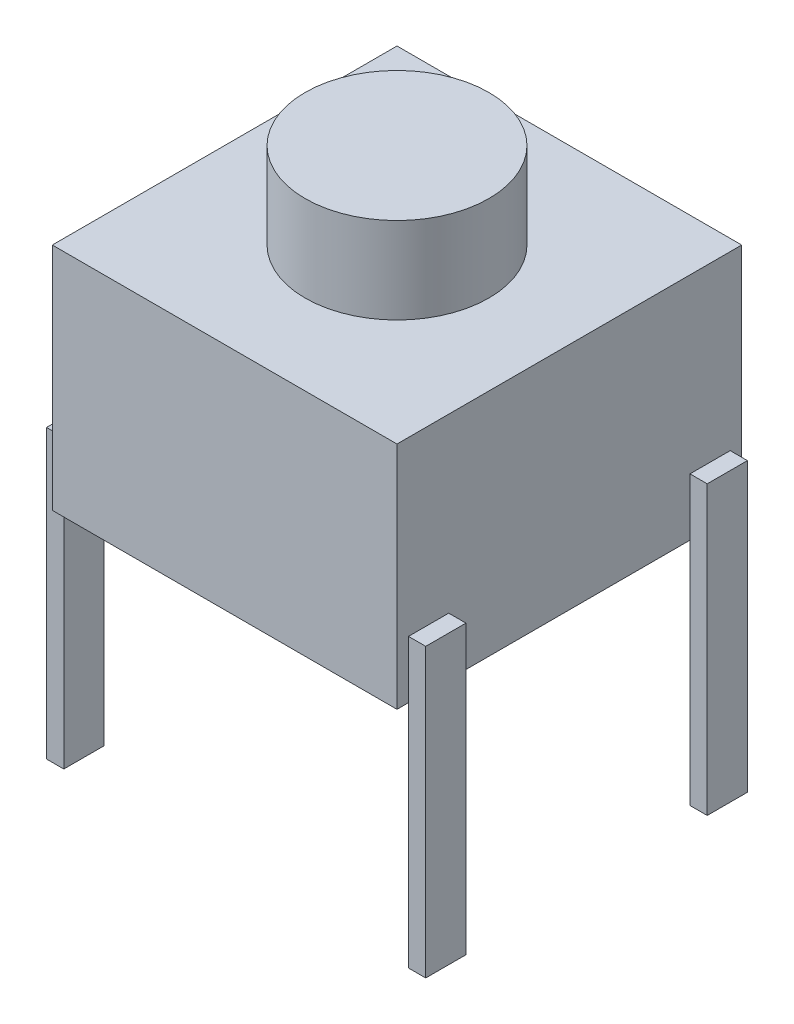
ISO-10303-21;
HEADER;
FILE_DESCRIPTION(('STEP AP214'),'2;1');
FILE_NAME('part.step','',(''),(''),'','','');
FILE_SCHEMA(('AUTOMOTIVE_DESIGN { 1 0 10303 214 1 1 1 1 }'));
ENDSEC;
DATA;
#1=APPLICATION_CONTEXT('core data for automotive mechanical design processes');
#2=APPLICATION_PROTOCOL_DEFINITION('international standard','automotive_design',2000,#1);
#3=PRODUCT_CONTEXT('',#1,'mechanical');
#4=PRODUCT('Part','Part','',(#3));
#5=PRODUCT_RELATED_PRODUCT_CATEGORY('part','',(#4));
#6=PRODUCT_DEFINITION_FORMATION('','',#4);
#7=PRODUCT_DEFINITION_CONTEXT('part definition',#1,'design');
#8=PRODUCT_DEFINITION('design','',#6,#7);
#9=PRODUCT_DEFINITION_SHAPE('','',#8);
#10=(LENGTH_UNIT() NAMED_UNIT(*) SI_UNIT(.MILLI.,.METRE.));
#11=(NAMED_UNIT(*) PLANE_ANGLE_UNIT() SI_UNIT($,.RADIAN.));
#12=(NAMED_UNIT(*) SI_UNIT($,.STERADIAN.) SOLID_ANGLE_UNIT());
#13=UNCERTAINTY_MEASURE_WITH_UNIT(LENGTH_MEASURE(1.E-05),#10,'distance_accuracy_value','');
#14=(GEOMETRIC_REPRESENTATION_CONTEXT(3) GLOBAL_UNCERTAINTY_ASSIGNED_CONTEXT((#13)) GLOBAL_UNIT_ASSIGNED_CONTEXT((#10,
#11,#12)) REPRESENTATION_CONTEXT('',''));
#15=CARTESIAN_POINT('',(0.,0.,0.));
#16=DIRECTION('',(0.,0.,1.));
#17=DIRECTION('',(1.,0.,0.));
#18=AXIS2_PLACEMENT_3D('',#15,#16,#17);
#19=CARTESIAN_POINT('',(6.,4.,0.));
#20=DIRECTION('',(-1.,0.,0.));
#21=DIRECTION('',(0.,0.,1.));
#22=AXIS2_PLACEMENT_3D('',#19,#20,#21);
#23=PLANE('',#22);
#24=DIRECTION('',(0.,1.,0.));
#25=VECTOR('',#24,1.);
#26=CARTESIAN_POINT('',(6.,1.,-5.1));
#27=LINE('',#26,#25);
#28=CARTESIAN_POINT('',(6.,0.,-5.1));
#29=VERTEX_POINT('',#28);
#30=CARTESIAN_POINT('',(6.,1.,-5.1));
#31=VERTEX_POINT('',#30);
#32=EDGE_CURVE('E54',#29,#31,#27,.T.);
#33=ORIENTED_EDGE('',*,*,#32,.T.);
#34=DIRECTION('',(0.,0.,-1.));
#35=VECTOR('',#34,1.);
#36=CARTESIAN_POINT('',(6.,1.,-5.1));
#37=LINE('',#36,#35);
#38=CARTESIAN_POINT('',(6.,1.,-5.8));
#39=VERTEX_POINT('',#38);
#40=EDGE_CURVE('E58',#31,#39,#37,.T.);
#41=ORIENTED_EDGE('',*,*,#40,.T.);
#42=DIRECTION('',(0.,-1.,0.));
#43=VECTOR('',#42,1.);
#44=CARTESIAN_POINT('',(6.,1.,-5.8));
#45=LINE('',#44,#43);
#46=CARTESIAN_POINT('',(6.,0.,-5.8));
#47=VERTEX_POINT('',#46);
#48=EDGE_CURVE('E210',#39,#47,#45,.T.);
#49=ORIENTED_EDGE('',*,*,#48,.T.);
#50=DIRECTION('',(0.,0.,-1.));
#51=VECTOR('',#50,1.);
#52=CARTESIAN_POINT('',(6.,0.,0.));
#53=LINE('',#52,#51);
#54=CARTESIAN_POINT('',(6.,0.,-6.));
#55=VERTEX_POINT('',#54);
#56=EDGE_CURVE('E366',#47,#55,#53,.T.);
#57=ORIENTED_EDGE('',*,*,#56,.T.);
#58=DIRECTION('',(0.,-1.,0.));
#59=VECTOR('',#58,1.);
#60=CARTESIAN_POINT('',(6.,4.,-6.));
#61=LINE('',#60,#59);
#62=CARTESIAN_POINT('',(6.,4.,-6.));
#63=VERTEX_POINT('',#62);
#64=EDGE_CURVE('E374',#63,#55,#61,.T.);
#65=ORIENTED_EDGE('',*,*,#64,.F.);
#66=DIRECTION('',(0.,0.,-1.));
#67=VECTOR('',#66,1.);
#68=CARTESIAN_POINT('',(6.,4.,0.));
#69=LINE('',#68,#67);
#70=CARTESIAN_POINT('',(6.,4.,0.));
#71=VERTEX_POINT('',#70);
#72=EDGE_CURVE('E353',#71,#63,#69,.T.);
#73=ORIENTED_EDGE('',*,*,#72,.F.);
#74=DIRECTION('',(0.,-1.,0.));
#75=VECTOR('',#74,1.);
#76=CARTESIAN_POINT('',(6.,4.,0.));
#77=LINE('',#76,#75);
#78=CARTESIAN_POINT('',(6.,0.,0.));
#79=VERTEX_POINT('',#78);
#80=EDGE_CURVE('E376',#71,#79,#77,.T.);
#81=ORIENTED_EDGE('',*,*,#80,.T.);
#82=CARTESIAN_POINT('',(6.,0.,-0.2));
#83=VERTEX_POINT('',#82);
#84=EDGE_CURVE('E367',#79,#83,#53,.T.);
#85=ORIENTED_EDGE('',*,*,#84,.T.);
#86=DIRECTION('',(0.,1.,0.));
#87=VECTOR('',#86,1.);
#88=CARTESIAN_POINT('',(6.,1.,-0.2));
#89=LINE('',#88,#87);
#90=CARTESIAN_POINT('',(6.,1.,-0.2));
#91=VERTEX_POINT('',#90);
#92=EDGE_CURVE('E11',#83,#91,#89,.T.);
#93=ORIENTED_EDGE('',*,*,#92,.T.);
#94=DIRECTION('',(0.,0.,-1.));
#95=VECTOR('',#94,1.);
#96=CARTESIAN_POINT('',(6.,1.,-0.2));
#97=LINE('',#96,#95);
#98=CARTESIAN_POINT('',(6.,1.,-0.9));
#99=VERTEX_POINT('',#98);
#100=EDGE_CURVE('E278',#91,#99,#97,.T.);
#101=ORIENTED_EDGE('',*,*,#100,.T.);
#102=DIRECTION('',(0.,-1.,0.));
#103=VECTOR('',#102,1.);
#104=CARTESIAN_POINT('',(6.,1.,-0.9));
#105=LINE('',#104,#103);
#106=CARTESIAN_POINT('',(6.,0.,-0.9));
#107=VERTEX_POINT('',#106);
#108=EDGE_CURVE('E283',#99,#107,#105,.T.);
#109=ORIENTED_EDGE('',*,*,#108,.T.);
#110=EDGE_CURVE('E420',#107,#29,#53,.T.);
#111=ORIENTED_EDGE('',*,*,#110,.T.);
#112=EDGE_LOOP('',(#33,#41,#49,#57,#65,#73,#81,#85,#93,#101,#109,#111));
#113=FACE_BOUND('',#112,.T.);
#114=ADVANCED_FACE('F36',(#113),#23,.F.);
#115=CARTESIAN_POINT('',(0.,4.,0.));
#116=DIRECTION('',(1.,0.,0.));
#117=DIRECTION('',(0.,0.,-1.));
#118=AXIS2_PLACEMENT_3D('',#115,#116,#117);
#119=PLANE('',#118);
#120=DIRECTION('',(0.,1.,0.));
#121=VECTOR('',#120,1.);
#122=CARTESIAN_POINT('',(0.,1.,-5.1));
#123=LINE('',#122,#121);
#124=CARTESIAN_POINT('',(0.,0.,-5.1));
#125=VERTEX_POINT('',#124);
#126=CARTESIAN_POINT('',(0.,1.,-5.1));
#127=VERTEX_POINT('',#126);
#128=EDGE_CURVE('E242',#125,#127,#123,.T.);
#129=ORIENTED_EDGE('',*,*,#128,.F.);
#130=DIRECTION('',(0.,0.,1.));
#131=VECTOR('',#130,1.);
#132=CARTESIAN_POINT('',(0.,0.,0.));
#133=LINE('',#132,#131);
#134=CARTESIAN_POINT('',(0.,0.,-0.9));
#135=VERTEX_POINT('',#134);
#136=EDGE_CURVE('E363',#125,#135,#133,.T.);
#137=ORIENTED_EDGE('',*,*,#136,.T.);
#138=DIRECTION('',(0.,-1.,0.));
#139=VECTOR('',#138,1.);
#140=CARTESIAN_POINT('',(0.,1.,-0.9));
#141=LINE('',#140,#139);
#142=CARTESIAN_POINT('',(0.,1.,-0.9));
#143=VERTEX_POINT('',#142);
#144=EDGE_CURVE('E325',#143,#135,#141,.T.);
#145=ORIENTED_EDGE('',*,*,#144,.F.);
#146=DIRECTION('',(0.,0.,-1.));
#147=VECTOR('',#146,1.);
#148=CARTESIAN_POINT('',(0.,1.,-0.2));
#149=LINE('',#148,#147);
#150=CARTESIAN_POINT('',(0.,1.,-0.2));
#151=VERTEX_POINT('',#150);
#152=EDGE_CURVE('E321',#151,#143,#149,.T.);
#153=ORIENTED_EDGE('',*,*,#152,.F.);
#154=DIRECTION('',(0.,1.,0.));
#155=VECTOR('',#154,1.);
#156=CARTESIAN_POINT('',(0.,1.,-0.2));
#157=LINE('',#156,#155);
#158=CARTESIAN_POINT('',(0.,0.,-0.2));
#159=VERTEX_POINT('',#158);
#160=EDGE_CURVE('E45',#159,#151,#157,.T.);
#161=ORIENTED_EDGE('',*,*,#160,.F.);
#162=CARTESIAN_POINT('',(0.,0.,0.));
#163=VERTEX_POINT('',#162);
#164=EDGE_CURVE('E343',#159,#163,#133,.T.);
#165=ORIENTED_EDGE('',*,*,#164,.T.);
#166=DIRECTION('',(0.,-1.,0.));
#167=VECTOR('',#166,1.);
#168=CARTESIAN_POINT('',(0.,4.,0.));
#169=LINE('',#168,#167);
#170=CARTESIAN_POINT('',(0.,4.,0.));
#171=VERTEX_POINT('',#170);
#172=EDGE_CURVE('E40',#171,#163,#169,.T.);
#173=ORIENTED_EDGE('',*,*,#172,.F.);
#174=DIRECTION('',(0.,0.,1.));
#175=VECTOR('',#174,1.);
#176=CARTESIAN_POINT('',(0.,4.,0.));
#177=LINE('',#176,#175);
#178=CARTESIAN_POINT('',(0.,4.,-6.));
#179=VERTEX_POINT('',#178);
#180=EDGE_CURVE('E347',#179,#171,#177,.T.);
#181=ORIENTED_EDGE('',*,*,#180,.F.);
#182=DIRECTION('',(0.,-1.,0.));
#183=VECTOR('',#182,1.);
#184=CARTESIAN_POINT('',(0.,4.,-6.));
#185=LINE('',#184,#183);
#186=CARTESIAN_POINT('',(0.,0.,-6.));
#187=VERTEX_POINT('',#186);
#188=EDGE_CURVE('E357',#179,#187,#185,.T.);
#189=ORIENTED_EDGE('',*,*,#188,.T.);
#190=CARTESIAN_POINT('',(0.,0.,-5.8));
#191=VERTEX_POINT('',#190);
#192=EDGE_CURVE('E358',#187,#191,#133,.T.);
#193=ORIENTED_EDGE('',*,*,#192,.T.);
#194=DIRECTION('',(0.,-1.,0.));
#195=VECTOR('',#194,1.);
#196=CARTESIAN_POINT('',(0.,1.,-5.8));
#197=LINE('',#196,#195);
#198=CARTESIAN_POINT('',(0.,1.,-5.8));
#199=VERTEX_POINT('',#198);
#200=EDGE_CURVE('E261',#199,#191,#197,.T.);
#201=ORIENTED_EDGE('',*,*,#200,.F.);
#202=DIRECTION('',(0.,0.,-1.));
#203=VECTOR('',#202,1.);
#204=CARTESIAN_POINT('',(0.,1.,-5.1));
#205=LINE('',#204,#203);
#206=EDGE_CURVE('E257',#127,#199,#205,.T.);
#207=ORIENTED_EDGE('',*,*,#206,.F.);
#208=EDGE_LOOP('',(#129,#137,#145,#153,#161,#165,#173,#181,#189,#193,#201,#207));
#209=FACE_BOUND('',#208,.T.);
#210=ADVANCED_FACE('F38',(#209),#119,.F.);
#211=CARTESIAN_POINT('',(0.,4.,0.));
#212=DIRECTION('',(0.,0.,-1.));
#213=DIRECTION('',(-1.,0.,0.));
#214=AXIS2_PLACEMENT_3D('',#211,#212,#213);
#215=PLANE('',#214);
#216=DIRECTION('',(1.,0.,0.));
#217=VECTOR('',#216,1.);
#218=CARTESIAN_POINT('',(0.,0.,0.));
#219=LINE('',#218,#217);
#220=EDGE_CURVE('E361',#163,#79,#219,.T.);
#221=ORIENTED_EDGE('',*,*,#220,.T.);
#222=ORIENTED_EDGE('',*,*,#80,.F.);
#223=DIRECTION('',(1.,0.,0.));
#224=VECTOR('',#223,1.);
#225=CARTESIAN_POINT('',(0.,4.,0.));
#226=LINE('',#225,#224);
#227=EDGE_CURVE('E350',#171,#71,#226,.T.);
#228=ORIENTED_EDGE('',*,*,#227,.F.);
#229=ORIENTED_EDGE('',*,*,#172,.T.);
#230=EDGE_LOOP('',(#221,#222,#228,#229));
#231=FACE_BOUND('',#230,.T.);
#232=ADVANCED_FACE('F384',(#231),#215,.F.);
#233=CARTESIAN_POINT('',(0.,4.,-6.));
#234=DIRECTION('',(0.,0.,1.));
#235=DIRECTION('',(1.,0.,0.));
#236=AXIS2_PLACEMENT_3D('',#233,#234,#235);
#237=PLANE('',#236);
#238=DIRECTION('',(-1.,0.,0.));
#239=VECTOR('',#238,1.);
#240=CARTESIAN_POINT('',(0.,0.,-6.));
#241=LINE('',#240,#239);
#242=EDGE_CURVE('E351',#55,#187,#241,.T.);
#243=ORIENTED_EDGE('',*,*,#242,.T.);
#244=ORIENTED_EDGE('',*,*,#188,.F.);
#245=DIRECTION('',(-1.,0.,0.));
#246=VECTOR('',#245,1.);
#247=CARTESIAN_POINT('',(0.,4.,-6.));
#248=LINE('',#247,#246);
#249=EDGE_CURVE('E355',#63,#179,#248,.T.);
#250=ORIENTED_EDGE('',*,*,#249,.F.);
#251=ORIENTED_EDGE('',*,*,#64,.T.);
#252=EDGE_LOOP('',(#243,#244,#250,#251));
#253=FACE_BOUND('',#252,.T.);
#254=ADVANCED_FACE('F425',(#253),#237,.F.);
#255=CARTESIAN_POINT('',(0.,4.,0.));
#256=DIRECTION('',(0.,-1.,0.));
#257=DIRECTION('',(0.,0.,-1.));
#258=AXIS2_PLACEMENT_3D('',#255,#256,#257);
#259=PLANE('',#258);
#260=CARTESIAN_POINT('',(3.,4.,-3.));
#261=DIRECTION('',(0.,1.,0.));
#262=DIRECTION('',(0.,0.,1.));
#263=AXIS2_PLACEMENT_3D('',#260,#261,#262);
#264=CIRCLE('',#263,1.6);
#265=CARTESIAN_POINT('',(3.,4.,-1.4));
#266=VERTEX_POINT('',#265);
#267=EDGE_CURVE('E344',#266,#266,#264,.T.);
#268=ORIENTED_EDGE('',*,*,#267,.F.);
#269=EDGE_LOOP('',(#268));
#270=FACE_BOUND('',#269,.T.);
#271=ORIENTED_EDGE('',*,*,#180,.T.);
#272=ORIENTED_EDGE('',*,*,#227,.T.);
#273=ORIENTED_EDGE('',*,*,#72,.T.);
#274=ORIENTED_EDGE('',*,*,#249,.T.);
#275=EDGE_LOOP('',(#271,#272,#273,#274));
#276=FACE_BOUND('',#275,.T.);
#277=ADVANCED_FACE('F472',(#270,#276),#259,.F.);
#278=CARTESIAN_POINT('',(0.,0.,0.));
#279=DIRECTION('',(0.,-1.,0.));
#280=DIRECTION('',(0.,0.,-1.));
#281=AXIS2_PLACEMENT_3D('',#278,#279,#280);
#282=PLANE('',#281);
#283=ORIENTED_EDGE('',*,*,#192,.F.);
#284=ORIENTED_EDGE('',*,*,#242,.F.);
#285=ORIENTED_EDGE('',*,*,#56,.F.);
#286=EDGE_CURVE('E207',#29,#47,#53,.T.);
#287=ORIENTED_EDGE('',*,*,#286,.F.);
#288=ORIENTED_EDGE('',*,*,#110,.F.);
#289=EDGE_CURVE('E370',#83,#107,#53,.T.);
#290=ORIENTED_EDGE('',*,*,#289,.F.);
#291=ORIENTED_EDGE('',*,*,#84,.F.);
#292=ORIENTED_EDGE('',*,*,#220,.F.);
#293=ORIENTED_EDGE('',*,*,#164,.F.);
#294=EDGE_CURVE('E364',#135,#159,#133,.T.);
#295=ORIENTED_EDGE('',*,*,#294,.F.);
#296=ORIENTED_EDGE('',*,*,#136,.F.);
#297=EDGE_CURVE('E362',#191,#125,#133,.T.);
#298=ORIENTED_EDGE('',*,*,#297,.F.);
#299=EDGE_LOOP('',(#283,#284,#285,#287,#288,#290,#291,#292,#293,#295,#296,#298));
#300=FACE_BOUND('',#299,.T.);
#301=ADVANCED_FACE('F395',(#300),#282,.T.);
#302=CARTESIAN_POINT('',(3.,5.5,-3.));
#303=DIRECTION('',(0.,-1.,0.));
#304=DIRECTION('',(0.,0.,-1.));
#305=AXIS2_PLACEMENT_3D('',#302,#303,#304);
#306=CYLINDRICAL_SURFACE('',#305,1.6);
#307=CARTESIAN_POINT('',(3.,5.5,-3.));
#308=DIRECTION('',(0.,1.,0.));
#309=DIRECTION('',(0.,0.,1.));
#310=AXIS2_PLACEMENT_3D('',#307,#308,#309);
#311=CIRCLE('',#310,1.6);
#312=CARTESIAN_POINT('',(3.,5.5,-1.4));
#313=VERTEX_POINT('',#312);
#314=EDGE_CURVE('E340',#313,#313,#311,.T.);
#315=ORIENTED_EDGE('',*,*,#314,.F.);
#316=EDGE_LOOP('',(#315));
#317=FACE_BOUND('',#316,.T.);
#318=ORIENTED_EDGE('',*,*,#267,.T.);
#319=EDGE_LOOP('',(#318));
#320=FACE_BOUND('',#319,.T.);
#321=ADVANCED_FACE('F481',(#317,#320),#306,.T.);
#322=CARTESIAN_POINT('',(3.,5.5,-3.));
#323=DIRECTION('',(0.,1.,0.));
#324=DIRECTION('',(0.,0.,1.));
#325=AXIS2_PLACEMENT_3D('',#322,#323,#324);
#326=PLANE('',#325);
#327=ORIENTED_EDGE('',*,*,#314,.T.);
#328=EDGE_LOOP('',(#327));
#329=FACE_BOUND('',#328,.T.);
#330=ADVANCED_FACE('F487',(#329),#326,.T.);
#331=CARTESIAN_POINT('',(-0.3,1.,-0.2));
#332=DIRECTION('',(0.,0.,-1.));
#333=DIRECTION('',(0.,1.,0.));
#334=AXIS2_PLACEMENT_3D('',#331,#332,#333);
#335=PLANE('',#334);
#336=CARTESIAN_POINT('',(0.,-4.,-0.199999999999999));
#337=VERTEX_POINT('',#336);
#338=EDGE_CURVE('E307',#337,#159,#157,.T.);
#339=ORIENTED_EDGE('',*,*,#338,.T.);
#340=ORIENTED_EDGE('',*,*,#160,.T.);
#341=DIRECTION('',(1.,0.,0.));
#342=VECTOR('',#341,1.);
#343=CARTESIAN_POINT('',(-0.3,1.,-0.2));
#344=LINE('',#343,#342);
#345=CARTESIAN_POINT('',(-0.3,1.,-0.2));
#346=VERTEX_POINT('',#345);
#347=EDGE_CURVE('E337',#346,#151,#344,.T.);
#348=ORIENTED_EDGE('',*,*,#347,.F.);
#349=DIRECTION('',(0.,1.,0.));
#350=VECTOR('',#349,1.);
#351=CARTESIAN_POINT('',(-0.3,1.,-0.2));
#352=LINE('',#351,#350);
#353=CARTESIAN_POINT('',(-0.3,-4.,-0.199999999999999));
#354=VERTEX_POINT('',#353);
#355=EDGE_CURVE('E308',#354,#346,#352,.T.);
#356=ORIENTED_EDGE('',*,*,#355,.F.);
#357=DIRECTION('',(1.,0.,0.));
#358=VECTOR('',#357,1.);
#359=CARTESIAN_POINT('',(-0.3,-4.,-0.199999999999999));
#360=LINE('',#359,#358);
#361=EDGE_CURVE('E318',#354,#337,#360,.T.);
#362=ORIENTED_EDGE('',*,*,#361,.T.);
#363=EDGE_LOOP('',(#339,#340,#348,#356,#362));
#364=FACE_BOUND('',#363,.T.);
#365=ADVANCED_FACE('F491',(#364),#335,.F.);
#366=CARTESIAN_POINT('',(-0.3,1.,-0.2));
#367=DIRECTION('',(0.,-1.,0.));
#368=DIRECTION('',(0.,0.,-1.));
#369=AXIS2_PLACEMENT_3D('',#366,#367,#368);
#370=PLANE('',#369);
#371=ORIENTED_EDGE('',*,*,#152,.T.);
#372=DIRECTION('',(1.,0.,0.));
#373=VECTOR('',#372,1.);
#374=CARTESIAN_POINT('',(-0.3,1.,-0.9));
#375=LINE('',#374,#373);
#376=CARTESIAN_POINT('',(-0.3,1.,-0.9));
#377=VERTEX_POINT('',#376);
#378=EDGE_CURVE('E334',#377,#143,#375,.T.);
#379=ORIENTED_EDGE('',*,*,#378,.F.);
#380=DIRECTION('',(0.,0.,-1.));
#381=VECTOR('',#380,1.);
#382=CARTESIAN_POINT('',(-0.3,1.,-0.2));
#383=LINE('',#382,#381);
#384=EDGE_CURVE('E311',#346,#377,#383,.T.);
#385=ORIENTED_EDGE('',*,*,#384,.F.);
#386=ORIENTED_EDGE('',*,*,#347,.T.);
#387=EDGE_LOOP('',(#371,#379,#385,#386));
#388=FACE_BOUND('',#387,.T.);
#389=ADVANCED_FACE('F495',(#388),#370,.F.);
#390=CARTESIAN_POINT('',(-0.3,1.,-0.9));
#391=DIRECTION('',(0.,0.,1.));
#392=DIRECTION('',(0.,-1.,0.));
#393=AXIS2_PLACEMENT_3D('',#390,#391,#392);
#394=PLANE('',#393);
#395=ORIENTED_EDGE('',*,*,#144,.T.);
#396=CARTESIAN_POINT('',(0.,-4.,-0.899999999999999));
#397=VERTEX_POINT('',#396);
#398=EDGE_CURVE('E324',#135,#397,#141,.T.);
#399=ORIENTED_EDGE('',*,*,#398,.T.);
#400=DIRECTION('',(1.,0.,0.));
#401=VECTOR('',#400,1.);
#402=CARTESIAN_POINT('',(-0.3,-4.,-0.899999999999999));
#403=LINE('',#402,#401);
#404=CARTESIAN_POINT('',(-0.3,-4.,-0.899999999999999));
#405=VERTEX_POINT('',#404);
#406=EDGE_CURVE('E331',#405,#397,#403,.T.);
#407=ORIENTED_EDGE('',*,*,#406,.F.);
#408=DIRECTION('',(0.,-1.,0.));
#409=VECTOR('',#408,1.);
#410=CARTESIAN_POINT('',(-0.3,1.,-0.9));
#411=LINE('',#410,#409);
#412=EDGE_CURVE('E314',#377,#405,#411,.T.);
#413=ORIENTED_EDGE('',*,*,#412,.F.);
#414=ORIENTED_EDGE('',*,*,#378,.T.);
#415=EDGE_LOOP('',(#395,#399,#407,#413,#414));
#416=FACE_BOUND('',#415,.T.);
#417=ADVANCED_FACE('F499',(#416),#394,.F.);
#418=CARTESIAN_POINT('',(-0.3,-4.,-0.199999999999999));
#419=DIRECTION('',(0.,1.,0.));
#420=DIRECTION('',(0.,0.,1.));
#421=AXIS2_PLACEMENT_3D('',#418,#419,#420);
#422=PLANE('',#421);
#423=DIRECTION('',(0.,0.,1.));
#424=VECTOR('',#423,1.);
#425=CARTESIAN_POINT('',(0.,-4.,-0.199999999999999));
#426=LINE('',#425,#424);
#427=EDGE_CURVE('E312',#397,#337,#426,.T.);
#428=ORIENTED_EDGE('',*,*,#427,.T.);
#429=ORIENTED_EDGE('',*,*,#361,.F.);
#430=DIRECTION('',(0.,0.,1.));
#431=VECTOR('',#430,1.);
#432=CARTESIAN_POINT('',(-0.3,-4.,-0.199999999999999));
#433=LINE('',#432,#431);
#434=EDGE_CURVE('E316',#405,#354,#433,.T.);
#435=ORIENTED_EDGE('',*,*,#434,.F.);
#436=ORIENTED_EDGE('',*,*,#406,.T.);
#437=EDGE_LOOP('',(#428,#429,#435,#436));
#438=FACE_BOUND('',#437,.T.);
#439=ADVANCED_FACE('F503',(#438),#422,.F.);
#440=CARTESIAN_POINT('',(-0.3,0.,0.));
#441=DIRECTION('',(1.,0.,0.));
#442=DIRECTION('',(0.,0.,-1.));
#443=AXIS2_PLACEMENT_3D('',#440,#441,#442);
#444=PLANE('',#443);
#445=ORIENTED_EDGE('',*,*,#355,.T.);
#446=ORIENTED_EDGE('',*,*,#384,.T.);
#447=ORIENTED_EDGE('',*,*,#412,.T.);
#448=ORIENTED_EDGE('',*,*,#434,.T.);
#449=EDGE_LOOP('',(#445,#446,#447,#448));
#450=FACE_BOUND('',#449,.T.);
#451=ADVANCED_FACE('F507',(#450),#444,.F.);
#452=CARTESIAN_POINT('',(0.,0.,0.));
#453=DIRECTION('',(1.,0.,0.));
#454=DIRECTION('',(0.,0.,-1.));
#455=AXIS2_PLACEMENT_3D('',#452,#453,#454);
#456=PLANE('',#455);
#457=ORIENTED_EDGE('',*,*,#398,.F.);
#458=ORIENTED_EDGE('',*,*,#294,.T.);
#459=ORIENTED_EDGE('',*,*,#338,.F.);
#460=ORIENTED_EDGE('',*,*,#427,.F.);
#461=EDGE_LOOP('',(#457,#458,#459,#460));
#462=FACE_BOUND('',#461,.T.);
#463=ADVANCED_FACE('F509',(#462),#456,.T.);
#464=CARTESIAN_POINT('',(6.,0.,0.));
#465=DIRECTION('',(1.,0.,0.));
#466=DIRECTION('',(0.,0.,-1.));
#467=AXIS2_PLACEMENT_3D('',#464,#465,#466);
#468=PLANE('',#467);
#469=CARTESIAN_POINT('',(6.,-4.,-0.199999999999999));
#470=VERTEX_POINT('',#469);
#471=EDGE_CURVE('E47',#470,#83,#89,.T.);
#472=ORIENTED_EDGE('',*,*,#471,.T.);
#473=ORIENTED_EDGE('',*,*,#289,.T.);
#474=CARTESIAN_POINT('',(6.,-4.,-0.899999999999999));
#475=VERTEX_POINT('',#474);
#476=EDGE_CURVE('E282',#107,#475,#105,.T.);
#477=ORIENTED_EDGE('',*,*,#476,.T.);
#478=DIRECTION('',(0.,0.,1.));
#479=VECTOR('',#478,1.);
#480=CARTESIAN_POINT('',(6.,-4.,-0.199999999999999));
#481=LINE('',#480,#479);
#482=EDGE_CURVE('E286',#475,#470,#481,.T.);
#483=ORIENTED_EDGE('',*,*,#482,.T.);
#484=EDGE_LOOP('',(#472,#473,#477,#483));
#485=FACE_BOUND('',#484,.T.);
#486=ADVANCED_FACE('F404',(#485),#468,.F.);
#487=CARTESIAN_POINT('',(6.,1.,-0.2));
#488=DIRECTION('',(0.,0.,-1.));
#489=DIRECTION('',(0.,1.,0.));
#490=AXIS2_PLACEMENT_3D('',#487,#488,#489);
#491=PLANE('',#490);
#492=DIRECTION('',(0.,1.,0.));
#493=VECTOR('',#492,1.);
#494=CARTESIAN_POINT('',(6.3,1.,-0.2));
#495=LINE('',#494,#493);
#496=CARTESIAN_POINT('',(6.3,-4.,-0.199999999999999));
#497=VERTEX_POINT('',#496);
#498=CARTESIAN_POINT('',(6.3,1.,-0.2));
#499=VERTEX_POINT('',#498);
#500=EDGE_CURVE('E275',#497,#499,#495,.T.);
#501=ORIENTED_EDGE('',*,*,#500,.T.);
#502=DIRECTION('',(1.,0.,0.));
#503=VECTOR('',#502,1.);
#504=CARTESIAN_POINT('',(6.,1.,-0.2));
#505=LINE('',#504,#503);
#506=EDGE_CURVE('E304',#91,#499,#505,.T.);
#507=ORIENTED_EDGE('',*,*,#506,.F.);
#508=ORIENTED_EDGE('',*,*,#92,.F.);
#509=ORIENTED_EDGE('',*,*,#471,.F.);
#510=DIRECTION('',(1.,0.,0.));
#511=VECTOR('',#510,1.);
#512=CARTESIAN_POINT('',(6.,-4.,-0.199999999999999));
#513=LINE('',#512,#511);
#514=EDGE_CURVE('E288',#470,#497,#513,.T.);
#515=ORIENTED_EDGE('',*,*,#514,.T.);
#516=EDGE_LOOP('',(#501,#507,#508,#509,#515));
#517=FACE_BOUND('',#516,.T.);
#518=ADVANCED_FACE('F402',(#517),#491,.F.);
#519=CARTESIAN_POINT('',(6.,1.,-0.2));
#520=DIRECTION('',(0.,-1.,0.));
#521=DIRECTION('',(0.,0.,-1.));
#522=AXIS2_PLACEMENT_3D('',#519,#520,#521);
#523=PLANE('',#522);
#524=DIRECTION('',(0.,0.,-1.));
#525=VECTOR('',#524,1.);
#526=CARTESIAN_POINT('',(6.3,1.,-0.2));
#527=LINE('',#526,#525);
#528=CARTESIAN_POINT('',(6.3,1.,-0.9));
#529=VERTEX_POINT('',#528);
#530=EDGE_CURVE('E291',#499,#529,#527,.T.);
#531=ORIENTED_EDGE('',*,*,#530,.T.);
#532=DIRECTION('',(1.,0.,0.));
#533=VECTOR('',#532,1.);
#534=CARTESIAN_POINT('',(6.,1.,-0.9));
#535=LINE('',#534,#533);
#536=EDGE_CURVE('E301',#99,#529,#535,.T.);
#537=ORIENTED_EDGE('',*,*,#536,.F.);
#538=ORIENTED_EDGE('',*,*,#100,.F.);
#539=ORIENTED_EDGE('',*,*,#506,.T.);
#540=EDGE_LOOP('',(#531,#537,#538,#539));
#541=FACE_BOUND('',#540,.T.);
#542=ADVANCED_FACE('F416',(#541),#523,.F.);
#543=CARTESIAN_POINT('',(6.,1.,-0.9));
#544=DIRECTION('',(0.,0.,1.));
#545=DIRECTION('',(0.,-1.,0.));
#546=AXIS2_PLACEMENT_3D('',#543,#544,#545);
#547=PLANE('',#546);
#548=DIRECTION('',(0.,-1.,0.));
#549=VECTOR('',#548,1.);
#550=CARTESIAN_POINT('',(6.3,1.,-0.9));
#551=LINE('',#550,#549);
#552=CARTESIAN_POINT('',(6.3,-4.,-0.899999999999999));
#553=VERTEX_POINT('',#552);
#554=EDGE_CURVE('E293',#529,#553,#551,.T.);
#555=ORIENTED_EDGE('',*,*,#554,.T.);
#556=DIRECTION('',(1.,0.,0.));
#557=VECTOR('',#556,1.);
#558=CARTESIAN_POINT('',(6.,-4.,-0.899999999999999));
#559=LINE('',#558,#557);
#560=EDGE_CURVE('E298',#475,#553,#559,.T.);
#561=ORIENTED_EDGE('',*,*,#560,.F.);
#562=ORIENTED_EDGE('',*,*,#476,.F.);
#563=ORIENTED_EDGE('',*,*,#108,.F.);
#564=ORIENTED_EDGE('',*,*,#536,.T.);
#565=EDGE_LOOP('',(#555,#561,#562,#563,#564));
#566=FACE_BOUND('',#565,.T.);
#567=ADVANCED_FACE('F419',(#566),#547,.F.);
#568=CARTESIAN_POINT('',(6.,-4.,-0.199999999999999));
#569=DIRECTION('',(0.,1.,0.));
#570=DIRECTION('',(0.,0.,1.));
#571=AXIS2_PLACEMENT_3D('',#568,#569,#570);
#572=PLANE('',#571);
#573=DIRECTION('',(0.,0.,1.));
#574=VECTOR('',#573,1.);
#575=CARTESIAN_POINT('',(6.3,-4.,-0.199999999999999));
#576=LINE('',#575,#574);
#577=EDGE_CURVE('E279',#553,#497,#576,.T.);
#578=ORIENTED_EDGE('',*,*,#577,.T.);
#579=ORIENTED_EDGE('',*,*,#514,.F.);
#580=ORIENTED_EDGE('',*,*,#482,.F.);
#581=ORIENTED_EDGE('',*,*,#560,.T.);
#582=EDGE_LOOP('',(#578,#579,#580,#581));
#583=FACE_BOUND('',#582,.T.);
#584=ADVANCED_FACE('F409',(#583),#572,.F.);
#585=CARTESIAN_POINT('',(6.3,0.,0.));
#586=DIRECTION('',(1.,0.,0.));
#587=DIRECTION('',(0.,0.,-1.));
#588=AXIS2_PLACEMENT_3D('',#585,#586,#587);
#589=PLANE('',#588);
#590=ORIENTED_EDGE('',*,*,#500,.F.);
#591=ORIENTED_EDGE('',*,*,#577,.F.);
#592=ORIENTED_EDGE('',*,*,#554,.F.);
#593=ORIENTED_EDGE('',*,*,#530,.F.);
#594=EDGE_LOOP('',(#590,#591,#592,#593));
#595=FACE_BOUND('',#594,.T.);
#596=ADVANCED_FACE('F413',(#595),#589,.T.);
#597=CARTESIAN_POINT('',(-0.3,1.,-5.1));
#598=DIRECTION('',(0.,0.,-1.));
#599=DIRECTION('',(0.,1.,0.));
#600=AXIS2_PLACEMENT_3D('',#597,#598,#599);
#601=PLANE('',#600);
#602=CARTESIAN_POINT('',(0.,-4.,-5.1));
#603=VERTEX_POINT('',#602);
#604=EDGE_CURVE('E254',#603,#125,#123,.T.);
#605=ORIENTED_EDGE('',*,*,#604,.T.);
#606=ORIENTED_EDGE('',*,*,#128,.T.);
#607=DIRECTION('',(1.,0.,0.));
#608=VECTOR('',#607,1.);
#609=CARTESIAN_POINT('',(-0.3,1.,-5.1));
#610=LINE('',#609,#608);
#611=CARTESIAN_POINT('',(-0.3,1.,-5.1));
#612=VERTEX_POINT('',#611);
#613=EDGE_CURVE('E273',#612,#127,#610,.T.);
#614=ORIENTED_EDGE('',*,*,#613,.F.);
#615=DIRECTION('',(0.,1.,0.));
#616=VECTOR('',#615,1.);
#617=CARTESIAN_POINT('',(-0.3,1.,-5.1));
#618=LINE('',#617,#616);
#619=CARTESIAN_POINT('',(-0.3,-4.,-5.1));
#620=VERTEX_POINT('',#619);
#621=EDGE_CURVE('E243',#620,#612,#618,.T.);
#622=ORIENTED_EDGE('',*,*,#621,.F.);
#623=DIRECTION('',(1.,0.,0.));
#624=VECTOR('',#623,1.);
#625=CARTESIAN_POINT('',(-0.3,-4.,-5.1));
#626=LINE('',#625,#624);
#627=EDGE_CURVE('E253',#620,#603,#626,.T.);
#628=ORIENTED_EDGE('',*,*,#627,.T.);
#629=EDGE_LOOP('',(#605,#606,#614,#622,#628));
#630=FACE_BOUND('',#629,.T.);
#631=ADVANCED_FACE('F443',(#630),#601,.F.);
#632=CARTESIAN_POINT('',(-0.3,1.,-5.1));
#633=DIRECTION('',(0.,-1.,0.));
#634=DIRECTION('',(0.,0.,-1.));
#635=AXIS2_PLACEMENT_3D('',#632,#633,#634);
#636=PLANE('',#635);
#637=ORIENTED_EDGE('',*,*,#206,.T.);
#638=DIRECTION('',(1.,0.,0.));
#639=VECTOR('',#638,1.);
#640=CARTESIAN_POINT('',(-0.3,1.,-5.8));
#641=LINE('',#640,#639);
#642=CARTESIAN_POINT('',(-0.3,1.,-5.8));
#643=VERTEX_POINT('',#642);
#644=EDGE_CURVE('E270',#643,#199,#641,.T.);
#645=ORIENTED_EDGE('',*,*,#644,.F.);
#646=DIRECTION('',(0.,0.,-1.));
#647=VECTOR('',#646,1.);
#648=CARTESIAN_POINT('',(-0.3,1.,-5.1));
#649=LINE('',#648,#647);
#650=EDGE_CURVE('E246',#612,#643,#649,.T.);
#651=ORIENTED_EDGE('',*,*,#650,.F.);
#652=ORIENTED_EDGE('',*,*,#613,.T.);
#653=EDGE_LOOP('',(#637,#645,#651,#652));
#654=FACE_BOUND('',#653,.T.);
#655=ADVANCED_FACE('F439',(#654),#636,.F.);
#656=CARTESIAN_POINT('',(-0.3,1.,-5.8));
#657=DIRECTION('',(0.,0.,1.));
#658=DIRECTION('',(0.,-1.,0.));
#659=AXIS2_PLACEMENT_3D('',#656,#657,#658);
#660=PLANE('',#659);
#661=ORIENTED_EDGE('',*,*,#200,.T.);
#662=CARTESIAN_POINT('',(0.,-4.,-5.8));
#663=VERTEX_POINT('',#662);
#664=EDGE_CURVE('E260',#191,#663,#197,.T.);
#665=ORIENTED_EDGE('',*,*,#664,.T.);
#666=DIRECTION('',(1.,0.,0.));
#667=VECTOR('',#666,1.);
#668=CARTESIAN_POINT('',(-0.3,-4.,-5.8));
#669=LINE('',#668,#667);
#670=CARTESIAN_POINT('',(-0.3,-4.,-5.8));
#671=VERTEX_POINT('',#670);
#672=EDGE_CURVE('E267',#671,#663,#669,.T.);
#673=ORIENTED_EDGE('',*,*,#672,.F.);
#674=DIRECTION('',(0.,-1.,0.));
#675=VECTOR('',#674,1.);
#676=CARTESIAN_POINT('',(-0.3,1.,-5.8));
#677=LINE('',#676,#675);
#678=EDGE_CURVE('E249',#643,#671,#677,.T.);
#679=ORIENTED_EDGE('',*,*,#678,.F.);
#680=ORIENTED_EDGE('',*,*,#644,.T.);
#681=EDGE_LOOP('',(#661,#665,#673,#679,#680));
#682=FACE_BOUND('',#681,.T.);
#683=ADVANCED_FACE('F435',(#682),#660,.F.);
#684=CARTESIAN_POINT('',(-0.3,-4.,-5.1));
#685=DIRECTION('',(0.,1.,0.));
#686=DIRECTION('',(0.,0.,1.));
#687=AXIS2_PLACEMENT_3D('',#684,#685,#686);
#688=PLANE('',#687);
#689=DIRECTION('',(0.,0.,1.));
#690=VECTOR('',#689,1.);
#691=CARTESIAN_POINT('',(0.,-4.,-5.1));
#692=LINE('',#691,#690);
#693=EDGE_CURVE('E247',#663,#603,#692,.T.);
#694=ORIENTED_EDGE('',*,*,#693,.T.);
#695=ORIENTED_EDGE('',*,*,#627,.F.);
#696=DIRECTION('',(0.,0.,1.));
#697=VECTOR('',#696,1.);
#698=CARTESIAN_POINT('',(-0.3,-4.,-5.1));
#699=LINE('',#698,#697);
#700=EDGE_CURVE('E251',#671,#620,#699,.T.);
#701=ORIENTED_EDGE('',*,*,#700,.F.);
#702=ORIENTED_EDGE('',*,*,#672,.T.);
#703=EDGE_LOOP('',(#694,#695,#701,#702));
#704=FACE_BOUND('',#703,.T.);
#705=ADVANCED_FACE('F448',(#704),#688,.F.);
#706=CARTESIAN_POINT('',(-0.3,0.,-4.9));
#707=DIRECTION('',(1.,0.,0.));
#708=DIRECTION('',(0.,0.,-1.));
#709=AXIS2_PLACEMENT_3D('',#706,#707,#708);
#710=PLANE('',#709);
#711=ORIENTED_EDGE('',*,*,#621,.T.);
#712=ORIENTED_EDGE('',*,*,#650,.T.);
#713=ORIENTED_EDGE('',*,*,#678,.T.);
#714=ORIENTED_EDGE('',*,*,#700,.T.);
#715=EDGE_LOOP('',(#711,#712,#713,#714));
#716=FACE_BOUND('',#715,.T.);
#717=ADVANCED_FACE('F450',(#716),#710,.F.);
#718=CARTESIAN_POINT('',(0.,0.,-4.9));
#719=DIRECTION('',(1.,0.,0.));
#720=DIRECTION('',(0.,0.,-1.));
#721=AXIS2_PLACEMENT_3D('',#718,#719,#720);
#722=PLANE('',#721);
#723=ORIENTED_EDGE('',*,*,#664,.F.);
#724=ORIENTED_EDGE('',*,*,#297,.T.);
#725=ORIENTED_EDGE('',*,*,#604,.F.);
#726=ORIENTED_EDGE('',*,*,#693,.F.);
#727=EDGE_LOOP('',(#723,#724,#725,#726));
#728=FACE_BOUND('',#727,.T.);
#729=ADVANCED_FACE('F431',(#728),#722,.T.);
#730=CARTESIAN_POINT('',(6.,1.,-5.1));
#731=DIRECTION('',(0.,0.,-1.));
#732=DIRECTION('',(0.,1.,0.));
#733=AXIS2_PLACEMENT_3D('',#730,#731,#732);
#734=PLANE('',#733);
#735=DIRECTION('',(0.,1.,0.));
#736=VECTOR('',#735,1.);
#737=CARTESIAN_POINT('',(6.3,1.,-5.1));
#738=LINE('',#737,#736);
#739=CARTESIAN_POINT('',(6.3,-4.,-5.1));
#740=VERTEX_POINT('',#739);
#741=CARTESIAN_POINT('',(6.3,1.,-5.1));
#742=VERTEX_POINT('',#741);
#743=EDGE_CURVE('E230',#740,#742,#738,.T.);
#744=ORIENTED_EDGE('',*,*,#743,.T.);
#745=DIRECTION('',(1.,0.,0.));
#746=VECTOR('',#745,1.);
#747=CARTESIAN_POINT('',(6.,1.,-5.1));
#748=LINE('',#747,#746);
#749=EDGE_CURVE('E239',#31,#742,#748,.T.);
#750=ORIENTED_EDGE('',*,*,#749,.F.);
#751=ORIENTED_EDGE('',*,*,#32,.F.);
#752=CARTESIAN_POINT('',(6.,-4.,-5.1));
#753=VERTEX_POINT('',#752);
#754=EDGE_CURVE('E609',#753,#29,#27,.T.);
#755=ORIENTED_EDGE('',*,*,#754,.F.);
#756=DIRECTION('',(1.,0.,0.));
#757=VECTOR('',#756,1.);
#758=CARTESIAN_POINT('',(6.,-4.,-5.1));
#759=LINE('',#758,#757);
#760=EDGE_CURVE('E221',#753,#740,#759,.T.);
#761=ORIENTED_EDGE('',*,*,#760,.T.);
#762=EDGE_LOOP('',(#744,#750,#751,#755,#761));
#763=FACE_BOUND('',#762,.T.);
#764=ADVANCED_FACE('F457',(#763),#734,.F.);
#765=CARTESIAN_POINT('',(6.,1.,-5.1));
#766=DIRECTION('',(0.,-1.,0.));
#767=DIRECTION('',(0.,0.,-1.));
#768=AXIS2_PLACEMENT_3D('',#765,#766,#767);
#769=PLANE('',#768);
#770=DIRECTION('',(0.,0.,-1.));
#771=VECTOR('',#770,1.);
#772=CARTESIAN_POINT('',(6.3,1.,-5.1));
#773=LINE('',#772,#771);
#774=CARTESIAN_POINT('',(6.3,1.,-5.8));
#775=VERTEX_POINT('',#774);
#776=EDGE_CURVE('E233',#742,#775,#773,.T.);
#777=ORIENTED_EDGE('',*,*,#776,.T.);
#778=DIRECTION('',(1.,0.,0.));
#779=VECTOR('',#778,1.);
#780=CARTESIAN_POINT('',(6.,1.,-5.8));
#781=LINE('',#780,#779);
#782=EDGE_CURVE('E220',#39,#775,#781,.T.);
#783=ORIENTED_EDGE('',*,*,#782,.F.);
#784=ORIENTED_EDGE('',*,*,#40,.F.);
#785=ORIENTED_EDGE('',*,*,#749,.T.);
#786=EDGE_LOOP('',(#777,#783,#784,#785));
#787=FACE_BOUND('',#786,.T.);
#788=ADVANCED_FACE('F560',(#787),#769,.F.);
#789=CARTESIAN_POINT('',(6.,1.,-5.8));
#790=DIRECTION('',(0.,0.,1.));
#791=DIRECTION('',(0.,-1.,0.));
#792=AXIS2_PLACEMENT_3D('',#789,#790,#791);
#793=PLANE('',#792);
#794=DIRECTION('',(0.,-1.,0.));
#795=VECTOR('',#794,1.);
#796=CARTESIAN_POINT('',(6.3,1.,-5.8));
#797=LINE('',#796,#795);
#798=CARTESIAN_POINT('',(6.3,-4.,-5.8));
#799=VERTEX_POINT('',#798);
#800=EDGE_CURVE('E217',#775,#799,#797,.T.);
#801=ORIENTED_EDGE('',*,*,#800,.T.);
#802=DIRECTION('',(1.,0.,0.));
#803=VECTOR('',#802,1.);
#804=CARTESIAN_POINT('',(6.,-4.,-5.8));
#805=LINE('',#804,#803);
#806=CARTESIAN_POINT('',(6.,-4.,-5.8));
#807=VERTEX_POINT('',#806);
#808=EDGE_CURVE('E213',#807,#799,#805,.T.);
#809=ORIENTED_EDGE('',*,*,#808,.F.);
#810=EDGE_CURVE('E200',#47,#807,#45,.T.);
#811=ORIENTED_EDGE('',*,*,#810,.F.);
#812=ORIENTED_EDGE('',*,*,#48,.F.);
#813=ORIENTED_EDGE('',*,*,#782,.T.);
#814=EDGE_LOOP('',(#801,#809,#811,#812,#813));
#815=FACE_BOUND('',#814,.T.);
#816=ADVANCED_FACE('F214',(#815),#793,.F.);
#817=CARTESIAN_POINT('',(6.,-4.,-5.1));
#818=DIRECTION('',(0.,1.,0.));
#819=DIRECTION('',(0.,0.,1.));
#820=AXIS2_PLACEMENT_3D('',#817,#818,#819);
#821=PLANE('',#820);
#822=DIRECTION('',(0.,0.,1.));
#823=VECTOR('',#822,1.);
#824=CARTESIAN_POINT('',(6.3,-4.,-5.1));
#825=LINE('',#824,#823);
#826=EDGE_CURVE('E236',#799,#740,#825,.T.);
#827=ORIENTED_EDGE('',*,*,#826,.T.);
#828=ORIENTED_EDGE('',*,*,#760,.F.);
#829=DIRECTION('',(0.,0.,1.));
#830=VECTOR('',#829,1.);
#831=CARTESIAN_POINT('',(6.,-4.,-5.1));
#832=LINE('',#831,#830);
#833=EDGE_CURVE('E205',#807,#753,#832,.T.);
#834=ORIENTED_EDGE('',*,*,#833,.F.);
#835=ORIENTED_EDGE('',*,*,#808,.T.);
#836=EDGE_LOOP('',(#827,#828,#834,#835));
#837=FACE_BOUND('',#836,.T.);
#838=ADVANCED_FACE('F223',(#837),#821,.F.);
#839=CARTESIAN_POINT('',(6.,0.,-4.9));
#840=DIRECTION('',(1.,0.,0.));
#841=DIRECTION('',(0.,0.,-1.));
#842=AXIS2_PLACEMENT_3D('',#839,#840,#841);
#843=PLANE('',#842);
#844=ORIENTED_EDGE('',*,*,#286,.T.);
#845=ORIENTED_EDGE('',*,*,#810,.T.);
#846=ORIENTED_EDGE('',*,*,#833,.T.);
#847=ORIENTED_EDGE('',*,*,#754,.T.);
#848=EDGE_LOOP('',(#844,#845,#846,#847));
#849=FACE_BOUND('',#848,.T.);
#850=ADVANCED_FACE('F202',(#849),#843,.F.);
#851=CARTESIAN_POINT('',(6.3,0.,-4.9));
#852=DIRECTION('',(1.,0.,0.));
#853=DIRECTION('',(0.,0.,-1.));
#854=AXIS2_PLACEMENT_3D('',#851,#852,#853);
#855=PLANE('',#854);
#856=ORIENTED_EDGE('',*,*,#743,.F.);
#857=ORIENTED_EDGE('',*,*,#826,.F.);
#858=ORIENTED_EDGE('',*,*,#800,.F.);
#859=ORIENTED_EDGE('',*,*,#776,.F.);
#860=EDGE_LOOP('',(#856,#857,#858,#859));
#861=FACE_BOUND('',#860,.T.);
#862=ADVANCED_FACE('F594',(#861),#855,.T.);
#863=CLOSED_SHELL('',(#114,#210,#232,#254,#277,#301,#321,#330,#365,#389,#417,#439,#451,#463,
#486,#518,#542,#567,#584,#596,#631,#655,#683,#705,#717,#729,#764,#788,#816,#838,#850,#862));
#864=MANIFOLD_SOLID_BREP('B2',#863);
#865=ADVANCED_BREP_SHAPE_REPRESENTATION('',(#18,#864),#14);
#866=SHAPE_DEFINITION_REPRESENTATION(#9,#865);
ENDSEC;
END-ISO-10303-21;
